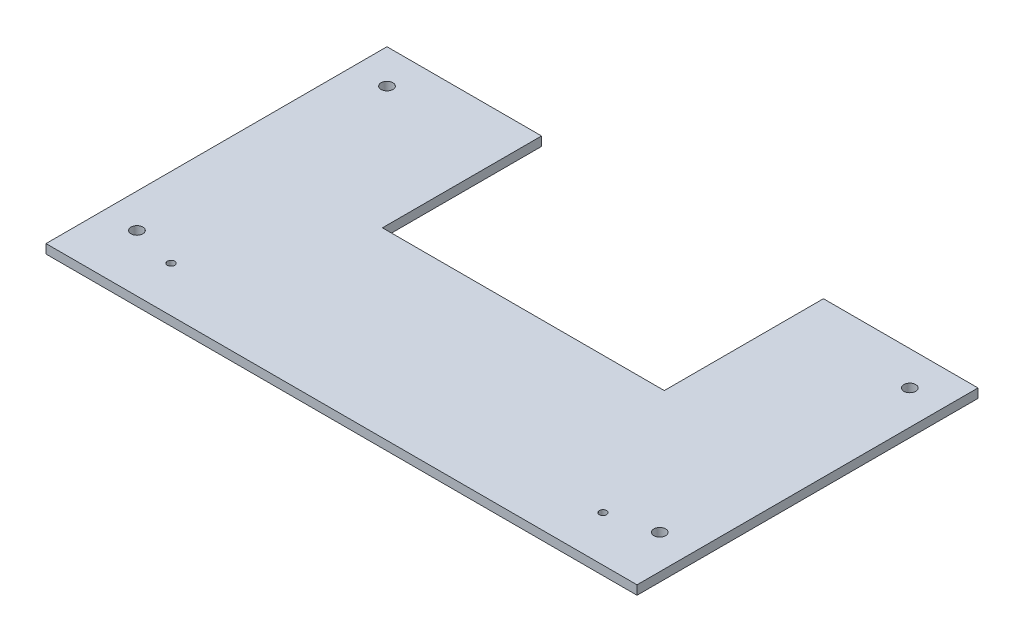
ISO-10303-21;
HEADER;
FILE_DESCRIPTION(('STEP AP214'),'2;1');
FILE_NAME('part.step','',(''),(''),'','','');
FILE_SCHEMA(('AUTOMOTIVE_DESIGN { 1 0 10303 214 1 1 1 1 }'));
ENDSEC;
DATA;
#1=APPLICATION_CONTEXT('core data for automotive mechanical design processes');
#2=APPLICATION_PROTOCOL_DEFINITION('international standard','automotive_design',2000,#1);
#3=PRODUCT_CONTEXT('',#1,'mechanical');
#4=PRODUCT('Part','Part','',(#3));
#5=PRODUCT_RELATED_PRODUCT_CATEGORY('part','',(#4));
#6=PRODUCT_DEFINITION_FORMATION('','',#4);
#7=PRODUCT_DEFINITION_CONTEXT('part definition',#1,'design');
#8=PRODUCT_DEFINITION('design','',#6,#7);
#9=PRODUCT_DEFINITION_SHAPE('','',#8);
#10=(LENGTH_UNIT() NAMED_UNIT(*) SI_UNIT(.MILLI.,.METRE.));
#11=(NAMED_UNIT(*) PLANE_ANGLE_UNIT() SI_UNIT($,.RADIAN.));
#12=(NAMED_UNIT(*) SI_UNIT($,.STERADIAN.) SOLID_ANGLE_UNIT());
#13=UNCERTAINTY_MEASURE_WITH_UNIT(LENGTH_MEASURE(1.E-05),#10,'distance_accuracy_value','');
#14=(GEOMETRIC_REPRESENTATION_CONTEXT(3) GLOBAL_UNCERTAINTY_ASSIGNED_CONTEXT((#13)) GLOBAL_UNIT_ASSIGNED_CONTEXT((#10,
#11,#12)) REPRESENTATION_CONTEXT('',''));
#15=CARTESIAN_POINT('',(0.,0.,0.));
#16=DIRECTION('',(0.,0.,1.));
#17=DIRECTION('',(1.,0.,0.));
#18=AXIS2_PLACEMENT_3D('',#15,#16,#17);
#19=CARTESIAN_POINT('',(-130.,4.,-75.));
#20=DIRECTION('',(0.,0.,1.));
#21=DIRECTION('',(1.,0.,0.));
#22=AXIS2_PLACEMENT_3D('',#19,#20,#21);
#23=PLANE('',#22);
#24=DIRECTION('',(-1.,0.,0.));
#25=VECTOR('',#24,1.);
#26=CARTESIAN_POINT('',(-130.,4.,-75.));
#27=LINE('',#26,#25);
#28=CARTESIAN_POINT('',(-62.,4.,-75.));
#29=VERTEX_POINT('',#28);
#30=CARTESIAN_POINT('',(-130.,4.,-75.));
#31=VERTEX_POINT('',#30);
#32=EDGE_CURVE('E190',#29,#31,#27,.T.);
#33=ORIENTED_EDGE('',*,*,#32,.F.);
#34=DIRECTION('',(0.,1.,0.));
#35=VECTOR('',#34,1.);
#36=CARTESIAN_POINT('',(-62.,0.,-75.));
#37=LINE('',#36,#35);
#38=CARTESIAN_POINT('',(-62.,0.,-75.));
#39=VERTEX_POINT('',#38);
#40=EDGE_CURVE('E162',#39,#29,#37,.T.);
#41=ORIENTED_EDGE('',*,*,#40,.F.);
#42=DIRECTION('',(-1.,0.,0.));
#43=VECTOR('',#42,1.);
#44=CARTESIAN_POINT('',(-130.,0.,-75.));
#45=LINE('',#44,#43);
#46=CARTESIAN_POINT('',(-130.,0.,-75.));
#47=VERTEX_POINT('',#46);
#48=EDGE_CURVE('E144',#39,#47,#45,.T.);
#49=ORIENTED_EDGE('',*,*,#48,.T.);
#50=DIRECTION('',(0.,-1.,0.));
#51=VECTOR('',#50,1.);
#52=CARTESIAN_POINT('',(-130.,4.,-75.));
#53=LINE('',#52,#51);
#54=EDGE_CURVE('E54',#31,#47,#53,.T.);
#55=ORIENTED_EDGE('',*,*,#54,.F.);
#56=EDGE_LOOP('',(#33,#41,#49,#55));
#57=FACE_BOUND('',#56,.T.);
#58=ADVANCED_FACE('F45',(#57),#23,.F.);
#59=CARTESIAN_POINT('',(130.,4.,75.));
#60=DIRECTION('',(-1.,0.,0.));
#61=DIRECTION('',(0.,0.,1.));
#62=AXIS2_PLACEMENT_3D('',#59,#60,#61);
#63=PLANE('',#62);
#64=DIRECTION('',(0.,0.,-1.));
#65=VECTOR('',#64,1.);
#66=CARTESIAN_POINT('',(130.,0.,75.));
#67=LINE('',#66,#65);
#68=CARTESIAN_POINT('',(130.,0.,75.));
#69=VERTEX_POINT('',#68);
#70=CARTESIAN_POINT('',(130.,0.,-75.));
#71=VERTEX_POINT('',#70);
#72=EDGE_CURVE('E165',#69,#71,#67,.T.);
#73=ORIENTED_EDGE('',*,*,#72,.T.);
#74=DIRECTION('',(0.,-1.,0.));
#75=VECTOR('',#74,1.);
#76=CARTESIAN_POINT('',(130.,4.,-75.));
#77=LINE('',#76,#75);
#78=CARTESIAN_POINT('',(130.,4.,-75.));
#79=VERTEX_POINT('',#78);
#80=EDGE_CURVE('E11',#79,#71,#77,.T.);
#81=ORIENTED_EDGE('',*,*,#80,.F.);
#82=DIRECTION('',(0.,0.,-1.));
#83=VECTOR('',#82,1.);
#84=CARTESIAN_POINT('',(130.,4.,75.));
#85=LINE('',#84,#83);
#86=CARTESIAN_POINT('',(130.,4.,75.));
#87=VERTEX_POINT('',#86);
#88=EDGE_CURVE('E187',#87,#79,#85,.T.);
#89=ORIENTED_EDGE('',*,*,#88,.F.);
#90=DIRECTION('',(0.,-1.,0.));
#91=VECTOR('',#90,1.);
#92=CARTESIAN_POINT('',(130.,4.,75.));
#93=LINE('',#92,#91);
#94=EDGE_CURVE('E198',#87,#69,#93,.T.);
#95=ORIENTED_EDGE('',*,*,#94,.T.);
#96=EDGE_LOOP('',(#73,#81,#89,#95));
#97=FACE_BOUND('',#96,.T.);
#98=ADVANCED_FACE('F47',(#97),#63,.F.);
#99=CARTESIAN_POINT('',(62.,0.,-75.));
#100=VERTEX_POINT('',#99);
#101=EDGE_CURVE('E202',#71,#100,#45,.T.);
#102=ORIENTED_EDGE('',*,*,#101,.T.);
#103=DIRECTION('',(0.,1.,0.));
#104=VECTOR('',#103,1.);
#105=CARTESIAN_POINT('',(62.,0.,-75.));
#106=LINE('',#105,#104);
#107=CARTESIAN_POINT('',(62.,4.,-75.));
#108=VERTEX_POINT('',#107);
#109=EDGE_CURVE('E166',#100,#108,#106,.T.);
#110=ORIENTED_EDGE('',*,*,#109,.T.);
#111=EDGE_CURVE('E98',#79,#108,#27,.T.);
#112=ORIENTED_EDGE('',*,*,#111,.F.);
#113=ORIENTED_EDGE('',*,*,#80,.T.);
#114=EDGE_LOOP('',(#102,#110,#112,#113));
#115=FACE_BOUND('',#114,.T.);
#116=ADVANCED_FACE('F239',(#115),#23,.F.);
#117=CARTESIAN_POINT('',(-130.,4.,75.));
#118=DIRECTION('',(1.,0.,0.));
#119=DIRECTION('',(0.,0.,-1.));
#120=AXIS2_PLACEMENT_3D('',#117,#118,#119);
#121=PLANE('',#120);
#122=DIRECTION('',(0.,0.,1.));
#123=VECTOR('',#122,1.);
#124=CARTESIAN_POINT('',(-130.,0.,75.));
#125=LINE('',#124,#123);
#126=CARTESIAN_POINT('',(-130.,0.,75.));
#127=VERTEX_POINT('',#126);
#128=EDGE_CURVE('E206',#47,#127,#125,.T.);
#129=ORIENTED_EDGE('',*,*,#128,.T.);
#130=DIRECTION('',(0.,-1.,0.));
#131=VECTOR('',#130,1.);
#132=CARTESIAN_POINT('',(-130.,4.,75.));
#133=LINE('',#132,#131);
#134=CARTESIAN_POINT('',(-130.,4.,75.));
#135=VERTEX_POINT('',#134);
#136=EDGE_CURVE('E213',#135,#127,#133,.T.);
#137=ORIENTED_EDGE('',*,*,#136,.F.);
#138=DIRECTION('',(0.,0.,1.));
#139=VECTOR('',#138,1.);
#140=CARTESIAN_POINT('',(-130.,4.,75.));
#141=LINE('',#140,#139);
#142=EDGE_CURVE('E193',#31,#135,#141,.T.);
#143=ORIENTED_EDGE('',*,*,#142,.F.);
#144=ORIENTED_EDGE('',*,*,#54,.T.);
#145=EDGE_LOOP('',(#129,#137,#143,#144));
#146=FACE_BOUND('',#145,.T.);
#147=ADVANCED_FACE('F220',(#146),#121,.F.);
#148=CARTESIAN_POINT('',(-130.,4.,75.));
#149=DIRECTION('',(0.,0.,-1.));
#150=DIRECTION('',(-1.,0.,0.));
#151=AXIS2_PLACEMENT_3D('',#148,#149,#150);
#152=PLANE('',#151);
#153=DIRECTION('',(1.,0.,0.));
#154=VECTOR('',#153,1.);
#155=CARTESIAN_POINT('',(-130.,0.,75.));
#156=LINE('',#155,#154);
#157=EDGE_CURVE('E91',#127,#69,#156,.T.);
#158=ORIENTED_EDGE('',*,*,#157,.T.);
#159=ORIENTED_EDGE('',*,*,#94,.F.);
#160=DIRECTION('',(1.,0.,0.));
#161=VECTOR('',#160,1.);
#162=CARTESIAN_POINT('',(-130.,4.,75.));
#163=LINE('',#162,#161);
#164=EDGE_CURVE('E70',#135,#87,#163,.T.);
#165=ORIENTED_EDGE('',*,*,#164,.F.);
#166=ORIENTED_EDGE('',*,*,#136,.T.);
#167=EDGE_LOOP('',(#158,#159,#165,#166));
#168=FACE_BOUND('',#167,.T.);
#169=ADVANCED_FACE('F228',(#168),#152,.F.);
#170=CARTESIAN_POINT('',(0.,4.,0.));
#171=DIRECTION('',(0.,-1.,0.));
#172=DIRECTION('',(0.,0.,-1.));
#173=AXIS2_PLACEMENT_3D('',#170,#171,#172);
#174=PLANE('',#173);
#175=CARTESIAN_POINT('',(-114.999999999999,4.,50.));
#176=DIRECTION('',(0.,1.,0.));
#177=DIRECTION('',(0.,0.,1.));
#178=AXIS2_PLACEMENT_3D('',#175,#176,#177);
#179=CIRCLE('',#178,2.6);
#180=CARTESIAN_POINT('',(-114.999999999999,4.,52.6));
#181=VERTEX_POINT('',#180);
#182=EDGE_CURVE('E296',#181,#181,#179,.T.);
#183=ORIENTED_EDGE('',*,*,#182,.F.);
#184=EDGE_LOOP('',(#183));
#185=FACE_BOUND('',#184,.T.);
#186=CARTESIAN_POINT('',(115.000000000001,4.,50.));
#187=DIRECTION('',(0.,1.,0.));
#188=DIRECTION('',(0.,0.,1.));
#189=AXIS2_PLACEMENT_3D('',#186,#187,#188);
#190=CIRCLE('',#189,2.6);
#191=CARTESIAN_POINT('',(115.000000000001,4.,52.6));
#192=VERTEX_POINT('',#191);
#193=EDGE_CURVE('E302',#192,#192,#190,.T.);
#194=ORIENTED_EDGE('',*,*,#193,.F.);
#195=EDGE_LOOP('',(#194));
#196=FACE_BOUND('',#195,.T.);
#197=CARTESIAN_POINT('',(115.,4.,-60.));
#198=DIRECTION('',(0.,1.,0.));
#199=DIRECTION('',(0.,0.,1.));
#200=AXIS2_PLACEMENT_3D('',#197,#198,#199);
#201=CIRCLE('',#200,2.6);
#202=CARTESIAN_POINT('',(115.,4.,-57.4));
#203=VERTEX_POINT('',#202);
#204=EDGE_CURVE('E292',#203,#203,#201,.T.);
#205=ORIENTED_EDGE('',*,*,#204,.F.);
#206=EDGE_LOOP('',(#205));
#207=FACE_BOUND('',#206,.T.);
#208=CARTESIAN_POINT('',(-115.,4.,-60.));
#209=DIRECTION('',(0.,1.,0.));
#210=DIRECTION('',(0.,0.,1.));
#211=AXIS2_PLACEMENT_3D('',#208,#209,#210);
#212=CIRCLE('',#211,2.6);
#213=CARTESIAN_POINT('',(-115.,4.,-57.4));
#214=VERTEX_POINT('',#213);
#215=EDGE_CURVE('E152',#214,#214,#212,.T.);
#216=ORIENTED_EDGE('',*,*,#215,.F.);
#217=EDGE_LOOP('',(#216));
#218=FACE_BOUND('',#217,.T.);
#219=CARTESIAN_POINT('',(95.,4.,55.));
#220=DIRECTION('',(0.,1.,0.));
#221=DIRECTION('',(0.,0.,1.));
#222=AXIS2_PLACEMENT_3D('',#219,#220,#221);
#223=CIRCLE('',#222,1.60000000000001);
#224=CARTESIAN_POINT('',(95.,4.,56.6));
#225=VERTEX_POINT('',#224);
#226=EDGE_CURVE('E159',#225,#225,#223,.T.);
#227=ORIENTED_EDGE('',*,*,#226,.F.);
#228=EDGE_LOOP('',(#227));
#229=FACE_BOUND('',#228,.T.);
#230=CARTESIAN_POINT('',(-95.,4.,55.0000000000013));
#231=DIRECTION('',(0.,1.,0.));
#232=DIRECTION('',(0.,0.,1.));
#233=AXIS2_PLACEMENT_3D('',#230,#231,#232);
#234=CIRCLE('',#233,1.60000000000001);
#235=CARTESIAN_POINT('',(-95.,4.,56.6000000000013));
#236=VERTEX_POINT('',#235);
#237=EDGE_CURVE('E178',#236,#236,#234,.T.);
#238=ORIENTED_EDGE('',*,*,#237,.F.);
#239=EDGE_LOOP('',(#238));
#240=FACE_BOUND('',#239,.T.);
#241=DIRECTION('',(1.,0.,0.));
#242=VECTOR('',#241,1.);
#243=CARTESIAN_POINT('',(-62.,4.,-5.));
#244=LINE('',#243,#242);
#245=CARTESIAN_POINT('',(-62.,4.,-5.));
#246=VERTEX_POINT('',#245);
#247=CARTESIAN_POINT('',(62.,4.,-5.));
#248=VERTEX_POINT('',#247);
#249=EDGE_CURVE('E149',#246,#248,#244,.T.);
#250=ORIENTED_EDGE('',*,*,#249,.F.);
#251=DIRECTION('',(0.,0.,1.));
#252=VECTOR('',#251,1.);
#253=CARTESIAN_POINT('',(-62.,4.,-5.));
#254=LINE('',#253,#252);
#255=EDGE_CURVE('E127',#29,#246,#254,.T.);
#256=ORIENTED_EDGE('',*,*,#255,.F.);
#257=ORIENTED_EDGE('',*,*,#32,.T.);
#258=ORIENTED_EDGE('',*,*,#142,.T.);
#259=ORIENTED_EDGE('',*,*,#164,.T.);
#260=ORIENTED_EDGE('',*,*,#88,.T.);
#261=ORIENTED_EDGE('',*,*,#111,.T.);
#262=DIRECTION('',(0.,0.,-1.));
#263=VECTOR('',#262,1.);
#264=CARTESIAN_POINT('',(62.,4.,-5.));
#265=LINE('',#264,#263);
#266=EDGE_CURVE('E146',#248,#108,#265,.T.);
#267=ORIENTED_EDGE('',*,*,#266,.F.);
#268=EDGE_LOOP('',(#250,#256,#257,#258,#259,#260,#261,#267));
#269=FACE_BOUND('',#268,.T.);
#270=ADVANCED_FACE('F230',(#185,#196,#207,#218,#229,#240,#269),#174,.F.);
#271=CARTESIAN_POINT('',(0.,0.,0.));
#272=DIRECTION('',(0.,-1.,0.));
#273=DIRECTION('',(0.,0.,-1.));
#274=AXIS2_PLACEMENT_3D('',#271,#272,#273);
#275=PLANE('',#274);
#276=CARTESIAN_POINT('',(-114.999999999999,0.,50.));
#277=DIRECTION('',(0.,1.,0.));
#278=DIRECTION('',(0.,0.,1.));
#279=AXIS2_PLACEMENT_3D('',#276,#277,#278);
#280=CIRCLE('',#279,2.6);
#281=CARTESIAN_POINT('',(-114.999999999999,0.,52.6));
#282=VERTEX_POINT('',#281);
#283=EDGE_CURVE('E277',#282,#282,#280,.T.);
#284=ORIENTED_EDGE('',*,*,#283,.T.);
#285=EDGE_LOOP('',(#284));
#286=FACE_BOUND('',#285,.T.);
#287=CARTESIAN_POINT('',(115.000000000001,0.,50.));
#288=DIRECTION('',(0.,1.,0.));
#289=DIRECTION('',(0.,0.,1.));
#290=AXIS2_PLACEMENT_3D('',#287,#288,#289);
#291=CIRCLE('',#290,2.6);
#292=CARTESIAN_POINT('',(115.000000000001,0.,52.6));
#293=VERTEX_POINT('',#292);
#294=EDGE_CURVE('E281',#293,#293,#291,.T.);
#295=ORIENTED_EDGE('',*,*,#294,.T.);
#296=EDGE_LOOP('',(#295));
#297=FACE_BOUND('',#296,.T.);
#298=CARTESIAN_POINT('',(115.,0.,-60.));
#299=DIRECTION('',(0.,1.,0.));
#300=DIRECTION('',(0.,0.,1.));
#301=AXIS2_PLACEMENT_3D('',#298,#299,#300);
#302=CIRCLE('',#301,2.6);
#303=CARTESIAN_POINT('',(115.,0.,-57.4));
#304=VERTEX_POINT('',#303);
#305=EDGE_CURVE('E285',#304,#304,#302,.T.);
#306=ORIENTED_EDGE('',*,*,#305,.T.);
#307=EDGE_LOOP('',(#306));
#308=FACE_BOUND('',#307,.T.);
#309=CARTESIAN_POINT('',(-115.,0.,-60.));
#310=DIRECTION('',(0.,1.,0.));
#311=DIRECTION('',(0.,0.,1.));
#312=AXIS2_PLACEMENT_3D('',#309,#310,#311);
#313=CIRCLE('',#312,2.6);
#314=CARTESIAN_POINT('',(-115.,0.,-57.4));
#315=VERTEX_POINT('',#314);
#316=EDGE_CURVE('E186',#315,#315,#313,.T.);
#317=ORIENTED_EDGE('',*,*,#316,.T.);
#318=EDGE_LOOP('',(#317));
#319=FACE_BOUND('',#318,.T.);
#320=DIRECTION('',(0.,0.,1.));
#321=VECTOR('',#320,1.);
#322=CARTESIAN_POINT('',(-62.,0.,-5.));
#323=LINE('',#322,#321);
#324=CARTESIAN_POINT('',(-62.,0.,-5.));
#325=VERTEX_POINT('',#324);
#326=EDGE_CURVE('E124',#39,#325,#323,.T.);
#327=ORIENTED_EDGE('',*,*,#326,.T.);
#328=DIRECTION('',(1.,0.,0.));
#329=VECTOR('',#328,1.);
#330=CARTESIAN_POINT('',(-62.,0.,-5.));
#331=LINE('',#330,#329);
#332=CARTESIAN_POINT('',(62.,0.,-5.));
#333=VERTEX_POINT('',#332);
#334=EDGE_CURVE('E135',#325,#333,#331,.T.);
#335=ORIENTED_EDGE('',*,*,#334,.T.);
#336=DIRECTION('',(0.,0.,-1.));
#337=VECTOR('',#336,1.);
#338=CARTESIAN_POINT('',(62.,0.,-5.));
#339=LINE('',#338,#337);
#340=EDGE_CURVE('E61',#333,#100,#339,.T.);
#341=ORIENTED_EDGE('',*,*,#340,.T.);
#342=ORIENTED_EDGE('',*,*,#101,.F.);
#343=ORIENTED_EDGE('',*,*,#72,.F.);
#344=ORIENTED_EDGE('',*,*,#157,.F.);
#345=ORIENTED_EDGE('',*,*,#128,.F.);
#346=ORIENTED_EDGE('',*,*,#48,.F.);
#347=EDGE_LOOP('',(#327,#335,#341,#342,#343,#344,#345,#346));
#348=FACE_BOUND('',#347,.T.);
#349=CARTESIAN_POINT('',(95.,0.,55.));
#350=DIRECTION('',(0.,1.,0.));
#351=DIRECTION('',(0.,0.,1.));
#352=AXIS2_PLACEMENT_3D('',#349,#350,#351);
#353=CIRCLE('',#352,1.60000000000001);
#354=CARTESIAN_POINT('',(95.,0.,56.6));
#355=VERTEX_POINT('',#354);
#356=EDGE_CURVE('E174',#355,#355,#353,.T.);
#357=ORIENTED_EDGE('',*,*,#356,.T.);
#358=EDGE_LOOP('',(#357));
#359=FACE_BOUND('',#358,.T.);
#360=CARTESIAN_POINT('',(-95.,0.,55.0000000000013));
#361=DIRECTION('',(0.,1.,0.));
#362=DIRECTION('',(0.,0.,1.));
#363=AXIS2_PLACEMENT_3D('',#360,#361,#362);
#364=CIRCLE('',#363,1.60000000000001);
#365=CARTESIAN_POINT('',(-95.,0.,56.6000000000013));
#366=VERTEX_POINT('',#365);
#367=EDGE_CURVE('E182',#366,#366,#364,.T.);
#368=ORIENTED_EDGE('',*,*,#367,.T.);
#369=EDGE_LOOP('',(#368));
#370=FACE_BOUND('',#369,.T.);
#371=ADVANCED_FACE('F141',(#286,#297,#308,#319,#348,#359,#370),#275,.T.);
#372=CARTESIAN_POINT('',(-95.,0.,55.0000000000013));
#373=DIRECTION('',(0.,1.,0.));
#374=DIRECTION('',(0.,0.,1.));
#375=AXIS2_PLACEMENT_3D('',#372,#373,#374);
#376=CYLINDRICAL_SURFACE('',#375,1.60000000000001);
#377=ORIENTED_EDGE('',*,*,#367,.F.);
#378=EDGE_LOOP('',(#377));
#379=FACE_BOUND('',#378,.T.);
#380=ORIENTED_EDGE('',*,*,#237,.T.);
#381=EDGE_LOOP('',(#380));
#382=FACE_BOUND('',#381,.T.);
#383=ADVANCED_FACE('F266',(#379,#382),#376,.F.);
#384=CARTESIAN_POINT('',(95.,0.,55.));
#385=DIRECTION('',(0.,1.,0.));
#386=DIRECTION('',(0.,0.,1.));
#387=AXIS2_PLACEMENT_3D('',#384,#385,#386);
#388=CYLINDRICAL_SURFACE('',#387,1.60000000000001);
#389=ORIENTED_EDGE('',*,*,#356,.F.);
#390=EDGE_LOOP('',(#389));
#391=FACE_BOUND('',#390,.T.);
#392=ORIENTED_EDGE('',*,*,#226,.T.);
#393=EDGE_LOOP('',(#392));
#394=FACE_BOUND('',#393,.T.);
#395=ADVANCED_FACE('F259',(#391,#394),#388,.F.);
#396=CARTESIAN_POINT('',(-62.,0.,-5.));
#397=DIRECTION('',(-1.,0.,0.));
#398=DIRECTION('',(0.,0.,1.));
#399=AXIS2_PLACEMENT_3D('',#396,#397,#398);
#400=PLANE('',#399);
#401=ORIENTED_EDGE('',*,*,#255,.T.);
#402=DIRECTION('',(0.,1.,0.));
#403=VECTOR('',#402,1.);
#404=CARTESIAN_POINT('',(-62.,0.,-5.));
#405=LINE('',#404,#403);
#406=EDGE_CURVE('E120',#325,#246,#405,.T.);
#407=ORIENTED_EDGE('',*,*,#406,.F.);
#408=ORIENTED_EDGE('',*,*,#326,.F.);
#409=ORIENTED_EDGE('',*,*,#40,.T.);
#410=EDGE_LOOP('',(#401,#407,#408,#409));
#411=FACE_BOUND('',#410,.T.);
#412=ADVANCED_FACE('F122',(#411),#400,.F.);
#413=CARTESIAN_POINT('',(62.,0.,-5.));
#414=DIRECTION('',(1.,0.,0.));
#415=DIRECTION('',(0.,0.,-1.));
#416=AXIS2_PLACEMENT_3D('',#413,#414,#415);
#417=PLANE('',#416);
#418=ORIENTED_EDGE('',*,*,#266,.T.);
#419=ORIENTED_EDGE('',*,*,#109,.F.);
#420=ORIENTED_EDGE('',*,*,#340,.F.);
#421=DIRECTION('',(0.,1.,0.));
#422=VECTOR('',#421,1.);
#423=CARTESIAN_POINT('',(62.,0.,-5.));
#424=LINE('',#423,#422);
#425=EDGE_CURVE('E132',#333,#248,#424,.T.);
#426=ORIENTED_EDGE('',*,*,#425,.T.);
#427=EDGE_LOOP('',(#418,#419,#420,#426));
#428=FACE_BOUND('',#427,.T.);
#429=ADVANCED_FACE('F250',(#428),#417,.F.);
#430=CARTESIAN_POINT('',(-62.,0.,-5.));
#431=DIRECTION('',(0.,0.,1.));
#432=DIRECTION('',(1.,0.,0.));
#433=AXIS2_PLACEMENT_3D('',#430,#431,#432);
#434=PLANE('',#433);
#435=ORIENTED_EDGE('',*,*,#249,.T.);
#436=ORIENTED_EDGE('',*,*,#425,.F.);
#437=ORIENTED_EDGE('',*,*,#334,.F.);
#438=ORIENTED_EDGE('',*,*,#406,.T.);
#439=EDGE_LOOP('',(#435,#436,#437,#438));
#440=FACE_BOUND('',#439,.T.);
#441=ADVANCED_FACE('F136',(#440),#434,.F.);
#442=CARTESIAN_POINT('',(-115.,0.,-60.));
#443=DIRECTION('',(0.,1.,0.));
#444=DIRECTION('',(0.,0.,1.));
#445=AXIS2_PLACEMENT_3D('',#442,#443,#444);
#446=CYLINDRICAL_SURFACE('',#445,2.6);
#447=ORIENTED_EDGE('',*,*,#316,.F.);
#448=EDGE_LOOP('',(#447));
#449=FACE_BOUND('',#448,.T.);
#450=ORIENTED_EDGE('',*,*,#215,.T.);
#451=EDGE_LOOP('',(#450));
#452=FACE_BOUND('',#451,.T.);
#453=ADVANCED_FACE('F257',(#449,#452),#446,.F.);
#454=CARTESIAN_POINT('',(115.,0.,-60.));
#455=DIRECTION('',(0.,1.,0.));
#456=DIRECTION('',(0.,0.,1.));
#457=AXIS2_PLACEMENT_3D('',#454,#455,#456);
#458=CYLINDRICAL_SURFACE('',#457,2.6);
#459=ORIENTED_EDGE('',*,*,#305,.F.);
#460=EDGE_LOOP('',(#459));
#461=FACE_BOUND('',#460,.T.);
#462=ORIENTED_EDGE('',*,*,#204,.T.);
#463=EDGE_LOOP('',(#462));
#464=FACE_BOUND('',#463,.T.);
#465=ADVANCED_FACE('F312',(#461,#464),#458,.F.);
#466=CARTESIAN_POINT('',(115.000000000001,0.,50.));
#467=DIRECTION('',(0.,1.,0.));
#468=DIRECTION('',(0.,0.,1.));
#469=AXIS2_PLACEMENT_3D('',#466,#467,#468);
#470=CYLINDRICAL_SURFACE('',#469,2.6);
#471=ORIENTED_EDGE('',*,*,#294,.F.);
#472=EDGE_LOOP('',(#471));
#473=FACE_BOUND('',#472,.T.);
#474=ORIENTED_EDGE('',*,*,#193,.T.);
#475=EDGE_LOOP('',(#474));
#476=FACE_BOUND('',#475,.T.);
#477=ADVANCED_FACE('F326',(#473,#476),#470,.F.);
#478=CARTESIAN_POINT('',(-114.999999999999,0.,50.));
#479=DIRECTION('',(0.,1.,0.));
#480=DIRECTION('',(0.,0.,1.));
#481=AXIS2_PLACEMENT_3D('',#478,#479,#480);
#482=CYLINDRICAL_SURFACE('',#481,2.6);
#483=ORIENTED_EDGE('',*,*,#283,.F.);
#484=EDGE_LOOP('',(#483));
#485=FACE_BOUND('',#484,.T.);
#486=ORIENTED_EDGE('',*,*,#182,.T.);
#487=EDGE_LOOP('',(#486));
#488=FACE_BOUND('',#487,.T.);
#489=ADVANCED_FACE('F332',(#485,#488),#482,.F.);
#490=CLOSED_SHELL('',(#58,#98,#116,#147,#169,#270,#371,#383,#395,#412,#429,#441,#453,#465,#477,#489));
#491=MANIFOLD_SOLID_BREP('B2',#490);
#492=ADVANCED_BREP_SHAPE_REPRESENTATION('',(#18,#491),#14);
#493=SHAPE_DEFINITION_REPRESENTATION(#9,#492);
ENDSEC;
END-ISO-10303-21;
